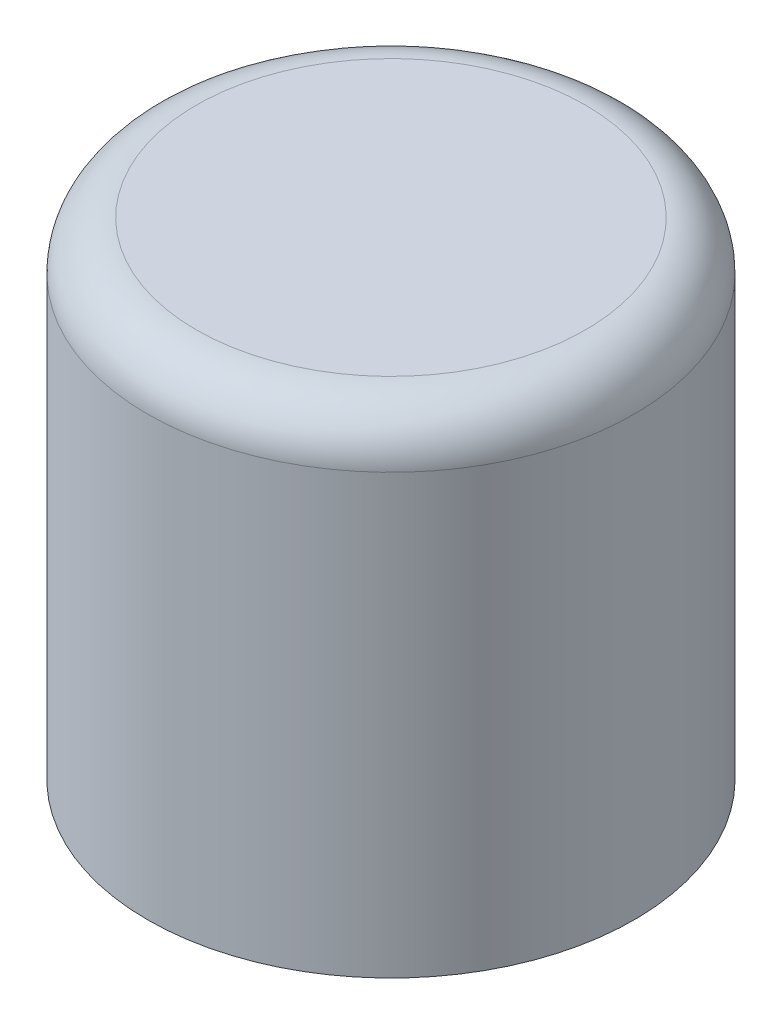
ISO-10303-21;
HEADER;
FILE_DESCRIPTION(('STEP AP214'),'2;1');
FILE_NAME('part.step','',(''),(''),'','','');
FILE_SCHEMA(('AUTOMOTIVE_DESIGN { 1 0 10303 214 1 1 1 1 }'));
ENDSEC;
DATA;
#1=APPLICATION_CONTEXT('core data for automotive mechanical design processes');
#2=APPLICATION_PROTOCOL_DEFINITION('international standard','automotive_design',2000,#1);
#3=PRODUCT_CONTEXT('',#1,'mechanical');
#4=PRODUCT('Part','Part','',(#3));
#5=PRODUCT_RELATED_PRODUCT_CATEGORY('part','',(#4));
#6=PRODUCT_DEFINITION_FORMATION('','',#4);
#7=PRODUCT_DEFINITION_CONTEXT('part definition',#1,'design');
#8=PRODUCT_DEFINITION('design','',#6,#7);
#9=PRODUCT_DEFINITION_SHAPE('','',#8);
#10=(LENGTH_UNIT() NAMED_UNIT(*) SI_UNIT(.MILLI.,.METRE.));
#11=(NAMED_UNIT(*) PLANE_ANGLE_UNIT() SI_UNIT($,.RADIAN.));
#12=(NAMED_UNIT(*) SI_UNIT($,.STERADIAN.) SOLID_ANGLE_UNIT());
#13=UNCERTAINTY_MEASURE_WITH_UNIT(LENGTH_MEASURE(1.E-05),#10,'distance_accuracy_value','');
#14=(GEOMETRIC_REPRESENTATION_CONTEXT(3) GLOBAL_UNCERTAINTY_ASSIGNED_CONTEXT((#13)) GLOBAL_UNIT_ASSIGNED_CONTEXT((#10,
#11,#12)) REPRESENTATION_CONTEXT('',''));
#15=CARTESIAN_POINT('',(0.,0.,0.));
#16=DIRECTION('',(0.,0.,1.));
#17=DIRECTION('',(1.,0.,0.));
#18=AXIS2_PLACEMENT_3D('',#15,#16,#17);
#19=CARTESIAN_POINT('',(0.,20.32,0.));
#20=DIRECTION('',(0.,-1.,0.));
#21=DIRECTION('',(0.,0.,-1.));
#22=AXIS2_PLACEMENT_3D('',#19,#20,#21);
#23=CYLINDRICAL_SURFACE('',#22,10.16);
#24=CARTESIAN_POINT('',(0.,18.288,0.));
#25=DIRECTION('',(0.,1.,0.));
#26=DIRECTION('',(0.,0.,1.));
#27=AXIS2_PLACEMENT_3D('',#24,#25,#26);
#28=CIRCLE('',#27,10.16);
#29=CARTESIAN_POINT('',(0.,18.288,10.16));
#30=VERTEX_POINT('',#29);
#31=EDGE_CURVE('E10',#30,#30,#28,.F.);
#32=ORIENTED_EDGE('',*,*,#31,.T.);
#33=EDGE_LOOP('',(#32));
#34=FACE_BOUND('',#33,.T.);
#35=CARTESIAN_POINT('',(0.,0.,0.));
#36=DIRECTION('',(0.,1.,0.));
#37=DIRECTION('',(0.,0.,1.));
#38=AXIS2_PLACEMENT_3D('',#35,#36,#37);
#39=CIRCLE('',#38,10.16);
#40=CARTESIAN_POINT('',(0.,0.,10.16));
#41=VERTEX_POINT('',#40);
#42=EDGE_CURVE('E46',#41,#41,#39,.T.);
#43=ORIENTED_EDGE('',*,*,#42,.T.);
#44=EDGE_LOOP('',(#43));
#45=FACE_BOUND('',#44,.T.);
#46=ADVANCED_FACE('F35',(#34,#45),#23,.T.);
#47=CARTESIAN_POINT('',(0.,20.32,0.));
#48=DIRECTION('',(0.,1.,0.));
#49=DIRECTION('',(0.,0.,1.));
#50=AXIS2_PLACEMENT_3D('',#47,#48,#49);
#51=PLANE('',#50);
#52=CARTESIAN_POINT('',(0.,20.32,0.));
#53=DIRECTION('',(0.,1.,0.));
#54=DIRECTION('',(0.,0.,1.));
#55=AXIS2_PLACEMENT_3D('',#52,#53,#54);
#56=CIRCLE('',#55,8.128);
#57=CARTESIAN_POINT('',(0.,20.32,8.128));
#58=VERTEX_POINT('',#57);
#59=EDGE_CURVE('E42',#58,#58,#56,.T.);
#60=ORIENTED_EDGE('',*,*,#59,.T.);
#61=EDGE_LOOP('',(#60));
#62=FACE_BOUND('',#61,.T.);
#63=ADVANCED_FACE('F56',(#62),#51,.T.);
#64=CARTESIAN_POINT('',(0.,0.,0.));
#65=DIRECTION('',(0.,1.,0.));
#66=DIRECTION('',(0.,0.,1.));
#67=AXIS2_PLACEMENT_3D('',#64,#65,#66);
#68=PLANE('',#67);
#69=ORIENTED_EDGE('',*,*,#42,.F.);
#70=EDGE_LOOP('',(#69));
#71=FACE_BOUND('',#70,.T.);
#72=ADVANCED_FACE('F54',(#71),#68,.F.);
#73=CARTESIAN_POINT('',(0.,18.288,0.));
#74=DIRECTION('',(0.,1.,0.));
#75=DIRECTION('',(0.,0.,1.));
#76=AXIS2_PLACEMENT_3D('',#73,#74,#75);
#77=TOROIDAL_SURFACE('',#76,8.128,2.032);
#78=ORIENTED_EDGE('',*,*,#31,.F.);
#79=EDGE_LOOP('',(#78));
#80=FACE_BOUND('',#79,.T.);
#81=ORIENTED_EDGE('',*,*,#59,.F.);
#82=EDGE_LOOP('',(#81));
#83=FACE_BOUND('',#82,.T.);
#84=ADVANCED_FACE('F37',(#80,#83),#77,.T.);
#85=CLOSED_SHELL('',(#46,#63,#72,#84));
#86=MANIFOLD_SOLID_BREP('B2',#85);
#87=ADVANCED_BREP_SHAPE_REPRESENTATION('',(#18,#86),#14);
#88=SHAPE_DEFINITION_REPRESENTATION(#9,#87);
ENDSEC;
END-ISO-10303-21;
